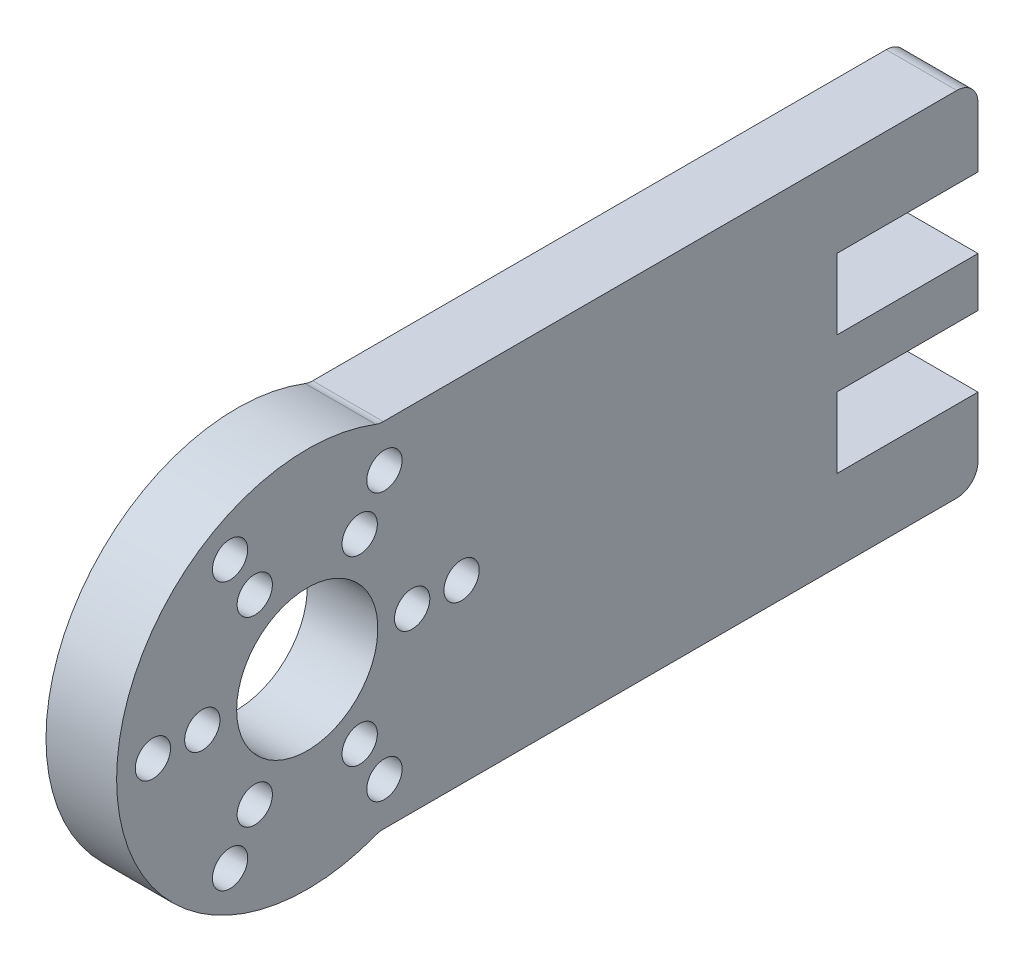
ISO-10303-21;
HEADER;
FILE_DESCRIPTION(('STEP AP214'),'2;1');
FILE_NAME('part.step','',(''),(''),'','','');
FILE_SCHEMA(('AUTOMOTIVE_DESIGN { 1 0 10303 214 1 1 1 1 }'));
ENDSEC;
DATA;
#1=APPLICATION_CONTEXT('core data for automotive mechanical design processes');
#2=APPLICATION_PROTOCOL_DEFINITION('international standard','automotive_design',2000,#1);
#3=PRODUCT_CONTEXT('',#1,'mechanical');
#4=PRODUCT('Part','Part','',(#3));
#5=PRODUCT_RELATED_PRODUCT_CATEGORY('part','',(#4));
#6=PRODUCT_DEFINITION_FORMATION('','',#4);
#7=PRODUCT_DEFINITION_CONTEXT('part definition',#1,'design');
#8=PRODUCT_DEFINITION('design','',#6,#7);
#9=PRODUCT_DEFINITION_SHAPE('','',#8);
#10=(LENGTH_UNIT() NAMED_UNIT(*) SI_UNIT(.MILLI.,.METRE.));
#11=(NAMED_UNIT(*) PLANE_ANGLE_UNIT() SI_UNIT($,.RADIAN.));
#12=(NAMED_UNIT(*) SI_UNIT($,.STERADIAN.) SOLID_ANGLE_UNIT());
#13=UNCERTAINTY_MEASURE_WITH_UNIT(LENGTH_MEASURE(1.E-05),#10,'distance_accuracy_value','');
#14=(GEOMETRIC_REPRESENTATION_CONTEXT(3) GLOBAL_UNCERTAINTY_ASSIGNED_CONTEXT((#13)) GLOBAL_UNIT_ASSIGNED_CONTEXT((#10,
#11,#12)) REPRESENTATION_CONTEXT('',''));
#15=CARTESIAN_POINT('',(0.,0.,0.));
#16=DIRECTION('',(0.,0.,1.));
#17=DIRECTION('',(1.,0.,0.));
#18=AXIS2_PLACEMENT_3D('',#15,#16,#17);
#19=CARTESIAN_POINT('',(5.,14.,42.1148351928655));
#20=DIRECTION('',(-1.,0.,0.));
#21=DIRECTION('',(0.,0.,1.));
#22=AXIS2_PLACEMENT_3D('',#19,#20,#21);
#23=CYLINDRICAL_SURFACE('',#22,1.5);
#24=DIRECTION('',(1.,0.,0.));
#25=VECTOR('',#24,1.);
#26=CARTESIAN_POINT('',(5.,12.5,42.1148351928655));
#27=LINE('',#26,#25);
#28=CARTESIAN_POINT('',(5.,12.5,42.1148351928655));
#29=VERTEX_POINT('',#28);
#30=CARTESIAN_POINT('',(0.,12.5,42.1148351928655));
#31=VERTEX_POINT('',#30);
#32=EDGE_CURVE('E98',#29,#31,#27,.F.);
#33=ORIENTED_EDGE('',*,*,#32,.T.);
#34=CARTESIAN_POINT('',(0.,14.,42.1148351928655));
#35=DIRECTION('',(-1.,0.,0.));
#36=DIRECTION('',(0.,0.,1.));
#37=AXIS2_PLACEMENT_3D('',#34,#35,#36);
#38=CIRCLE('',#37,1.5);
#39=CARTESIAN_POINT('',(0.,12.6,42.653351673579));
#40=VERTEX_POINT('',#39);
#41=EDGE_CURVE('E19',#40,#31,#38,.F.);
#42=ORIENTED_EDGE('',*,*,#41,.F.);
#43=DIRECTION('',(-1.,0.,0.));
#44=VECTOR('',#43,1.);
#45=CARTESIAN_POINT('',(5.,12.6,42.653351673579));
#46=LINE('',#45,#44);
#47=CARTESIAN_POINT('',(5.,12.6,42.653351673579));
#48=VERTEX_POINT('',#47);
#49=EDGE_CURVE('E149',#48,#40,#46,.T.);
#50=ORIENTED_EDGE('',*,*,#49,.F.);
#51=CARTESIAN_POINT('',(5.,14.,42.1148351928655));
#52=DIRECTION('',(-1.,0.,0.));
#53=DIRECTION('',(0.,0.,1.));
#54=AXIS2_PLACEMENT_3D('',#51,#52,#53);
#55=CIRCLE('',#54,1.5);
#56=EDGE_CURVE('E100',#29,#48,#55,.T.);
#57=ORIENTED_EDGE('',*,*,#56,.F.);
#58=EDGE_LOOP('',(#33,#42,#50,#57));
#59=FACE_BOUND('',#58,.T.);
#60=ADVANCED_FACE('F16',(#59),#23,.F.);
#61=CARTESIAN_POINT('',(5.,-14.,42.1148351928655));
#62=DIRECTION('',(-1.,0.,0.));
#63=DIRECTION('',(0.,0.,1.));
#64=AXIS2_PLACEMENT_3D('',#61,#62,#63);
#65=CYLINDRICAL_SURFACE('',#64,1.5);
#66=DIRECTION('',(-1.,0.,0.));
#67=VECTOR('',#66,1.);
#68=CARTESIAN_POINT('',(5.,-12.6,42.6533516735789));
#69=LINE('',#68,#67);
#70=CARTESIAN_POINT('',(0.,-12.6,42.6533516735789));
#71=VERTEX_POINT('',#70);
#72=CARTESIAN_POINT('',(5.,-12.6,42.6533516735789));
#73=VERTEX_POINT('',#72);
#74=EDGE_CURVE('E145',#71,#73,#69,.F.);
#75=ORIENTED_EDGE('',*,*,#74,.F.);
#76=CARTESIAN_POINT('',(0.,-14.,42.1148351928655));
#77=DIRECTION('',(-1.,0.,0.));
#78=DIRECTION('',(0.,0.,1.));
#79=AXIS2_PLACEMENT_3D('',#76,#77,#78);
#80=CIRCLE('',#79,1.5);
#81=CARTESIAN_POINT('',(0.,-12.5,42.1148351928655));
#82=VERTEX_POINT('',#81);
#83=EDGE_CURVE('E96',#82,#71,#80,.F.);
#84=ORIENTED_EDGE('',*,*,#83,.F.);
#85=DIRECTION('',(1.,0.,0.));
#86=VECTOR('',#85,1.);
#87=CARTESIAN_POINT('',(5.,-12.5,42.1148351928655));
#88=LINE('',#87,#86);
#89=CARTESIAN_POINT('',(5.,-12.5,42.1148351928655));
#90=VERTEX_POINT('',#89);
#91=EDGE_CURVE('E141',#90,#82,#88,.F.);
#92=ORIENTED_EDGE('',*,*,#91,.F.);
#93=CARTESIAN_POINT('',(5.,-14.,42.1148351928655));
#94=DIRECTION('',(-1.,0.,0.));
#95=DIRECTION('',(0.,0.,1.));
#96=AXIS2_PLACEMENT_3D('',#93,#94,#95);
#97=CIRCLE('',#96,1.5);
#98=EDGE_CURVE('E345',#73,#90,#97,.T.);
#99=ORIENTED_EDGE('',*,*,#98,.F.);
#100=EDGE_LOOP('',(#75,#84,#92,#99));
#101=FACE_BOUND('',#100,.T.);
#102=ADVANCED_FACE('F352',(#101),#65,.F.);
#103=CARTESIAN_POINT('',(5.,0.,0.));
#104=DIRECTION('',(1.,0.,0.));
#105=DIRECTION('',(0.,0.,-1.));
#106=AXIS2_PLACEMENT_3D('',#103,#104,#105);
#107=PLANE('',#106);
#108=CARTESIAN_POINT('',(5.,0.,47.5));
#109=DIRECTION('',(-1.,0.,0.));
#110=DIRECTION('',(0.,0.,1.));
#111=AXIS2_PLACEMENT_3D('',#108,#109,#110);
#112=CIRCLE('',#111,13.5);
#113=EDGE_CURVE('E148',#73,#48,#112,.T.);
#114=ORIENTED_EDGE('',*,*,#113,.F.);
#115=ORIENTED_EDGE('',*,*,#98,.T.);
#116=DIRECTION('',(0.,0.,-1.));
#117=VECTOR('',#116,1.);
#118=CARTESIAN_POINT('',(5.,-12.5,0.));
#119=LINE('',#118,#117);
#120=CARTESIAN_POINT('',(5.,-12.5,1.5));
#121=VERTEX_POINT('',#120);
#122=EDGE_CURVE('E144',#121,#90,#119,.F.);
#123=ORIENTED_EDGE('',*,*,#122,.F.);
#124=CARTESIAN_POINT('',(5.,-11.,1.5));
#125=DIRECTION('',(-1.,0.,0.));
#126=DIRECTION('',(0.,0.,1.));
#127=AXIS2_PLACEMENT_3D('',#124,#125,#126);
#128=CIRCLE('',#127,1.5);
#129=CARTESIAN_POINT('',(5.,-11.,0.));
#130=VERTEX_POINT('',#129);
#131=EDGE_CURVE('E140',#130,#121,#128,.T.);
#132=ORIENTED_EDGE('',*,*,#131,.F.);
#133=DIRECTION('',(0.,1.,0.));
#134=VECTOR('',#133,1.);
#135=CARTESIAN_POINT('',(5.,0.,0.));
#136=LINE('',#135,#134);
#137=CARTESIAN_POINT('',(5.,-6.75,0.));
#138=VERTEX_POINT('',#137);
#139=EDGE_CURVE('E125',#138,#130,#136,.F.);
#140=ORIENTED_EDGE('',*,*,#139,.F.);
#141=DIRECTION('',(0.,0.,1.));
#142=VECTOR('',#141,1.);
#143=CARTESIAN_POINT('',(5.,-6.75,0.));
#144=LINE('',#143,#142);
#145=CARTESIAN_POINT('',(5.,-6.75,10.));
#146=VERTEX_POINT('',#145);
#147=EDGE_CURVE('E225',#146,#138,#144,.F.);
#148=ORIENTED_EDGE('',*,*,#147,.F.);
#149=DIRECTION('',(0.,1.,0.));
#150=VECTOR('',#149,1.);
#151=CARTESIAN_POINT('',(5.,0.,10.));
#152=LINE('',#151,#150);
#153=CARTESIAN_POINT('',(5.,-1.75,10.));
#154=VERTEX_POINT('',#153);
#155=EDGE_CURVE('E222',#154,#146,#152,.F.);
#156=ORIENTED_EDGE('',*,*,#155,.F.);
#157=DIRECTION('',(0.,0.,-1.));
#158=VECTOR('',#157,1.);
#159=CARTESIAN_POINT('',(5.,-1.75,0.));
#160=LINE('',#159,#158);
#161=CARTESIAN_POINT('',(5.,-1.75,0.));
#162=VERTEX_POINT('',#161);
#163=EDGE_CURVE('E212',#162,#154,#160,.F.);
#164=ORIENTED_EDGE('',*,*,#163,.F.);
#165=DIRECTION('',(0.,1.,0.));
#166=VECTOR('',#165,1.);
#167=CARTESIAN_POINT('',(5.,0.,0.));
#168=LINE('',#167,#166);
#169=CARTESIAN_POINT('',(5.,1.75,0.));
#170=VERTEX_POINT('',#169);
#171=EDGE_CURVE('E202',#170,#162,#168,.F.);
#172=ORIENTED_EDGE('',*,*,#171,.F.);
#173=DIRECTION('',(0.,0.,-1.));
#174=VECTOR('',#173,1.);
#175=CARTESIAN_POINT('',(5.,1.75,0.));
#176=LINE('',#175,#174);
#177=CARTESIAN_POINT('',(5.,1.75,10.));
#178=VERTEX_POINT('',#177);
#179=EDGE_CURVE('E181',#170,#178,#176,.F.);
#180=ORIENTED_EDGE('',*,*,#179,.T.);
#181=DIRECTION('',(0.,1.,0.));
#182=VECTOR('',#181,1.);
#183=CARTESIAN_POINT('',(5.,0.,10.));
#184=LINE('',#183,#182);
#185=CARTESIAN_POINT('',(5.,6.75,10.));
#186=VERTEX_POINT('',#185);
#187=EDGE_CURVE('E170',#178,#186,#184,.T.);
#188=ORIENTED_EDGE('',*,*,#187,.T.);
#189=DIRECTION('',(0.,0.,1.));
#190=VECTOR('',#189,1.);
#191=CARTESIAN_POINT('',(5.,6.75,0.));
#192=LINE('',#191,#190);
#193=CARTESIAN_POINT('',(5.,6.75,0.));
#194=VERTEX_POINT('',#193);
#195=EDGE_CURVE('E159',#186,#194,#192,.F.);
#196=ORIENTED_EDGE('',*,*,#195,.T.);
#197=DIRECTION('',(0.,1.,0.));
#198=VECTOR('',#197,1.);
#199=CARTESIAN_POINT('',(5.,0.,0.));
#200=LINE('',#199,#198);
#201=CARTESIAN_POINT('',(5.,11.,0.));
#202=VERTEX_POINT('',#201);
#203=EDGE_CURVE('E158',#194,#202,#200,.T.);
#204=ORIENTED_EDGE('',*,*,#203,.T.);
#205=CARTESIAN_POINT('',(5.,11.,1.5));
#206=DIRECTION('',(-1.,0.,0.));
#207=DIRECTION('',(0.,0.,1.));
#208=AXIS2_PLACEMENT_3D('',#205,#206,#207);
#209=CIRCLE('',#208,1.5);
#210=CARTESIAN_POINT('',(5.,12.5,1.5));
#211=VERTEX_POINT('',#210);
#212=EDGE_CURVE('E154',#211,#202,#209,.T.);
#213=ORIENTED_EDGE('',*,*,#212,.F.);
#214=DIRECTION('',(0.,0.,-1.));
#215=VECTOR('',#214,1.);
#216=CARTESIAN_POINT('',(5.,12.5,0.));
#217=LINE('',#216,#215);
#218=EDGE_CURVE('E151',#211,#29,#217,.F.);
#219=ORIENTED_EDGE('',*,*,#218,.T.);
#220=ORIENTED_EDGE('',*,*,#56,.T.);
#221=EDGE_LOOP('',(#114,#115,#123,#132,#140,#148,#156,#164,#172,#180,#188,#196,#204,#213,#219,#220));
#222=FACE_BOUND('',#221,.T.);
#223=CARTESIAN_POINT('',(5.,6.43456875011842,43.785));
#224=DIRECTION('',(-1.,0.,0.));
#225=DIRECTION('',(0.,0.,1.));
#226=AXIS2_PLACEMENT_3D('',#223,#224,#225);
#227=CIRCLE('',#226,1.24999999999999);
#228=CARTESIAN_POINT('',(5.,6.43456875011842,45.035));
#229=VERTEX_POINT('',#228);
#230=EDGE_CURVE('E228',#229,#229,#227,.T.);
#231=ORIENTED_EDGE('',*,*,#230,.T.);
#232=EDGE_LOOP('',(#231));
#233=FACE_BOUND('',#232,.T.);
#234=CARTESIAN_POINT('',(5.,9.46565766336415,42.0349999999999));
#235=DIRECTION('',(-1.,0.,0.));
#236=DIRECTION('',(0.,0.,1.));
#237=AXIS2_PLACEMENT_3D('',#234,#235,#236);
#238=CIRCLE('',#237,1.24999999999999);
#239=CARTESIAN_POINT('',(5.,9.46565766336415,43.2849999999999));
#240=VERTEX_POINT('',#239);
#241=EDGE_CURVE('E309',#240,#240,#238,.T.);
#242=ORIENTED_EDGE('',*,*,#241,.T.);
#243=EDGE_LOOP('',(#242));
#244=FACE_BOUND('',#243,.T.);
#245=CARTESIAN_POINT('',(5.,6.43456875011861,51.2150000000001));
#246=DIRECTION('',(-1.,0.,0.));
#247=DIRECTION('',(0.,0.,1.));
#248=AXIS2_PLACEMENT_3D('',#245,#246,#247);
#249=CIRCLE('',#248,1.25);
#250=CARTESIAN_POINT('',(5.,6.43456875011861,52.4650000000001));
#251=VERTEX_POINT('',#250);
#252=EDGE_CURVE('E312',#251,#251,#249,.T.);
#253=ORIENTED_EDGE('',*,*,#252,.T.);
#254=EDGE_LOOP('',(#253));
#255=FACE_BOUND('',#254,.T.);
#256=CARTESIAN_POINT('',(5.,9.46565766336395,52.965));
#257=DIRECTION('',(-1.,0.,0.));
#258=DIRECTION('',(0.,0.,1.));
#259=AXIS2_PLACEMENT_3D('',#256,#257,#258);
#260=CIRCLE('',#259,1.25);
#261=CARTESIAN_POINT('',(5.,9.46565766336395,54.215));
#262=VERTEX_POINT('',#261);
#263=EDGE_CURVE('E315',#262,#262,#260,.T.);
#264=ORIENTED_EDGE('',*,*,#263,.T.);
#265=EDGE_LOOP('',(#264));
#266=FACE_BOUND('',#265,.T.);
#267=CARTESIAN_POINT('',(5.,0.,54.93));
#268=DIRECTION('',(-1.,0.,0.));
#269=DIRECTION('',(0.,0.,1.));
#270=AXIS2_PLACEMENT_3D('',#267,#268,#269);
#271=CIRCLE('',#270,1.24999999999999);
#272=CARTESIAN_POINT('',(5.,0.,56.18));
#273=VERTEX_POINT('',#272);
#274=EDGE_CURVE('E318',#273,#273,#271,.T.);
#275=ORIENTED_EDGE('',*,*,#274,.T.);
#276=EDGE_LOOP('',(#275));
#277=FACE_BOUND('',#276,.T.);
#278=CARTESIAN_POINT('',(5.,0.,58.43));
#279=DIRECTION('',(-1.,0.,0.));
#280=DIRECTION('',(0.,0.,1.));
#281=AXIS2_PLACEMENT_3D('',#278,#279,#280);
#282=CIRCLE('',#281,1.24999999999999);
#283=CARTESIAN_POINT('',(5.,0.,59.68));
#284=VERTEX_POINT('',#283);
#285=EDGE_CURVE('E321',#284,#284,#282,.T.);
#286=ORIENTED_EDGE('',*,*,#285,.T.);
#287=EDGE_LOOP('',(#286));
#288=FACE_BOUND('',#287,.T.);
#289=CARTESIAN_POINT('',(5.,0.,47.5));
#290=DIRECTION('',(-1.,0.,0.));
#291=DIRECTION('',(0.,0.,1.));
#292=AXIS2_PLACEMENT_3D('',#289,#290,#291);
#293=CIRCLE('',#292,5.);
#294=CARTESIAN_POINT('',(5.,0.,52.5));
#295=VERTEX_POINT('',#294);
#296=EDGE_CURVE('E324',#295,#295,#293,.T.);
#297=ORIENTED_EDGE('',*,*,#296,.T.);
#298=EDGE_LOOP('',(#297));
#299=FACE_BOUND('',#298,.T.);
#300=CARTESIAN_POINT('',(5.,0.,36.57));
#301=DIRECTION('',(-1.,0.,0.));
#302=DIRECTION('',(0.,0.,1.));
#303=AXIS2_PLACEMENT_3D('',#300,#301,#302);
#304=CIRCLE('',#303,1.24999999999999);
#305=CARTESIAN_POINT('',(5.,0.,37.82));
#306=VERTEX_POINT('',#305);
#307=EDGE_CURVE('E327',#306,#306,#304,.T.);
#308=ORIENTED_EDGE('',*,*,#307,.T.);
#309=EDGE_LOOP('',(#308));
#310=FACE_BOUND('',#309,.T.);
#311=CARTESIAN_POINT('',(5.,0.,40.07));
#312=DIRECTION('',(-1.,0.,0.));
#313=DIRECTION('',(0.,0.,1.));
#314=AXIS2_PLACEMENT_3D('',#311,#312,#313);
#315=CIRCLE('',#314,1.24999999999999);
#316=CARTESIAN_POINT('',(5.,0.,41.32));
#317=VERTEX_POINT('',#316);
#318=EDGE_CURVE('E330',#317,#317,#315,.T.);
#319=ORIENTED_EDGE('',*,*,#318,.T.);
#320=EDGE_LOOP('',(#319));
#321=FACE_BOUND('',#320,.T.);
#322=CARTESIAN_POINT('',(5.,-9.46565766336389,42.035));
#323=DIRECTION('',(-1.,0.,0.));
#324=DIRECTION('',(0.,0.,1.));
#325=AXIS2_PLACEMENT_3D('',#322,#323,#324);
#326=CIRCLE('',#325,1.24999999999999);
#327=CARTESIAN_POINT('',(5.,-9.46565766336389,43.285));
#328=VERTEX_POINT('',#327);
#329=EDGE_CURVE('E333',#328,#328,#326,.T.);
#330=ORIENTED_EDGE('',*,*,#329,.T.);
#331=EDGE_LOOP('',(#330));
#332=FACE_BOUND('',#331,.T.);
#333=CARTESIAN_POINT('',(5.,-6.43456875011817,43.7850000000001));
#334=DIRECTION('',(-1.,0.,0.));
#335=DIRECTION('',(0.,0.,1.));
#336=AXIS2_PLACEMENT_3D('',#333,#334,#335);
#337=CIRCLE('',#336,1.24999999999999);
#338=CARTESIAN_POINT('',(5.,-6.43456875011817,45.0350000000001));
#339=VERTEX_POINT('',#338);
#340=EDGE_CURVE('E336',#339,#339,#337,.T.);
#341=ORIENTED_EDGE('',*,*,#340,.T.);
#342=EDGE_LOOP('',(#341));
#343=FACE_BOUND('',#342,.T.);
#344=CARTESIAN_POINT('',(5.,-9.46565766336371,52.9649999999999));
#345=DIRECTION('',(-1.,0.,0.));
#346=DIRECTION('',(0.,0.,1.));
#347=AXIS2_PLACEMENT_3D('',#344,#345,#346);
#348=CIRCLE('',#347,1.25000000000001);
#349=CARTESIAN_POINT('',(5.,-9.46565766336371,54.2149999999999));
#350=VERTEX_POINT('',#349);
#351=EDGE_CURVE('E339',#350,#350,#348,.T.);
#352=ORIENTED_EDGE('',*,*,#351,.T.);
#353=EDGE_LOOP('',(#352));
#354=FACE_BOUND('',#353,.T.);
#355=CARTESIAN_POINT('',(5.,-6.43456875011817,51.2149999999999));
#356=DIRECTION('',(-1.,0.,0.));
#357=DIRECTION('',(0.,0.,1.));
#358=AXIS2_PLACEMENT_3D('',#355,#356,#357);
#359=CIRCLE('',#358,1.24999999999999);
#360=CARTESIAN_POINT('',(5.,-6.43456875011817,52.4649999999999));
#361=VERTEX_POINT('',#360);
#362=EDGE_CURVE('E342',#361,#361,#359,.T.);
#363=ORIENTED_EDGE('',*,*,#362,.T.);
#364=EDGE_LOOP('',(#363));
#365=FACE_BOUND('',#364,.T.);
#366=ADVANCED_FACE('F357',(#222,#233,#244,#255,#266,#277,#288,#299,#310,#321,#332,#343,#354,
#365),#107,.T.);
#367=CARTESIAN_POINT('',(5.,-6.43456875011817,51.2149999999999));
#368=DIRECTION('',(-1.,0.,0.));
#369=DIRECTION('',(0.,0.,1.));
#370=AXIS2_PLACEMENT_3D('',#367,#368,#369);
#371=CYLINDRICAL_SURFACE('',#370,1.24999999999999);
#372=CARTESIAN_POINT('',(0.,-6.43456875011817,51.2149999999999));
#373=DIRECTION('',(-1.,0.,0.));
#374=DIRECTION('',(0.,0.,1.));
#375=AXIS2_PLACEMENT_3D('',#372,#373,#374);
#376=CIRCLE('',#375,1.24999999999999);
#377=CARTESIAN_POINT('',(0.,-6.43456875011817,52.4649999999999));
#378=VERTEX_POINT('',#377);
#379=EDGE_CURVE('E128',#378,#378,#376,.T.);
#380=ORIENTED_EDGE('',*,*,#379,.T.);
#381=EDGE_LOOP('',(#380));
#382=FACE_BOUND('',#381,.T.);
#383=ORIENTED_EDGE('',*,*,#362,.F.);
#384=EDGE_LOOP('',(#383));
#385=FACE_BOUND('',#384,.T.);
#386=ADVANCED_FACE('F668',(#382,#385),#371,.F.);
#387=CARTESIAN_POINT('',(5.,-9.46565766336371,52.9649999999999));
#388=DIRECTION('',(-1.,0.,0.));
#389=DIRECTION('',(0.,0.,1.));
#390=AXIS2_PLACEMENT_3D('',#387,#388,#389);
#391=CYLINDRICAL_SURFACE('',#390,1.25000000000001);
#392=CARTESIAN_POINT('',(0.,-9.46565766336371,52.9649999999999));
#393=DIRECTION('',(-1.,0.,0.));
#394=DIRECTION('',(0.,0.,1.));
#395=AXIS2_PLACEMENT_3D('',#392,#393,#394);
#396=CIRCLE('',#395,1.25000000000001);
#397=CARTESIAN_POINT('',(0.,-9.46565766336371,54.2149999999999));
#398=VERTEX_POINT('',#397);
#399=EDGE_CURVE('E299',#398,#398,#396,.T.);
#400=ORIENTED_EDGE('',*,*,#399,.T.);
#401=EDGE_LOOP('',(#400));
#402=FACE_BOUND('',#401,.T.);
#403=ORIENTED_EDGE('',*,*,#351,.F.);
#404=EDGE_LOOP('',(#403));
#405=FACE_BOUND('',#404,.T.);
#406=ADVANCED_FACE('F659',(#402,#405),#391,.F.);
#407=CARTESIAN_POINT('',(5.,-6.43456875011817,43.7850000000001));
#408=DIRECTION('',(-1.,0.,0.));
#409=DIRECTION('',(0.,0.,1.));
#410=AXIS2_PLACEMENT_3D('',#407,#408,#409);
#411=CYLINDRICAL_SURFACE('',#410,1.24999999999999);
#412=CARTESIAN_POINT('',(0.,-6.43456875011817,43.7850000000001));
#413=DIRECTION('',(-1.,0.,0.));
#414=DIRECTION('',(0.,0.,1.));
#415=AXIS2_PLACEMENT_3D('',#412,#413,#414);
#416=CIRCLE('',#415,1.24999999999999);
#417=CARTESIAN_POINT('',(0.,-6.43456875011817,45.0350000000001));
#418=VERTEX_POINT('',#417);
#419=EDGE_CURVE('E296',#418,#418,#416,.T.);
#420=ORIENTED_EDGE('',*,*,#419,.T.);
#421=EDGE_LOOP('',(#420));
#422=FACE_BOUND('',#421,.T.);
#423=ORIENTED_EDGE('',*,*,#340,.F.);
#424=EDGE_LOOP('',(#423));
#425=FACE_BOUND('',#424,.T.);
#426=ADVANCED_FACE('F650',(#422,#425),#411,.F.);
#427=CARTESIAN_POINT('',(5.,-9.46565766336389,42.035));
#428=DIRECTION('',(-1.,0.,0.));
#429=DIRECTION('',(0.,0.,1.));
#430=AXIS2_PLACEMENT_3D('',#427,#428,#429);
#431=CYLINDRICAL_SURFACE('',#430,1.24999999999999);
#432=CARTESIAN_POINT('',(0.,-9.46565766336389,42.035));
#433=DIRECTION('',(-1.,0.,0.));
#434=DIRECTION('',(0.,0.,1.));
#435=AXIS2_PLACEMENT_3D('',#432,#433,#434);
#436=CIRCLE('',#435,1.24999999999999);
#437=CARTESIAN_POINT('',(0.,-9.46565766336389,43.285));
#438=VERTEX_POINT('',#437);
#439=EDGE_CURVE('E293',#438,#438,#436,.T.);
#440=ORIENTED_EDGE('',*,*,#439,.T.);
#441=EDGE_LOOP('',(#440));
#442=FACE_BOUND('',#441,.T.);
#443=ORIENTED_EDGE('',*,*,#329,.F.);
#444=EDGE_LOOP('',(#443));
#445=FACE_BOUND('',#444,.T.);
#446=ADVANCED_FACE('F641',(#442,#445),#431,.F.);
#447=CARTESIAN_POINT('',(5.,0.,40.07));
#448=DIRECTION('',(-1.,0.,0.));
#449=DIRECTION('',(0.,0.,1.));
#450=AXIS2_PLACEMENT_3D('',#447,#448,#449);
#451=CYLINDRICAL_SURFACE('',#450,1.24999999999999);
#452=CARTESIAN_POINT('',(0.,0.,40.07));
#453=DIRECTION('',(-1.,0.,0.));
#454=DIRECTION('',(0.,0.,1.));
#455=AXIS2_PLACEMENT_3D('',#452,#453,#454);
#456=CIRCLE('',#455,1.24999999999999);
#457=CARTESIAN_POINT('',(0.,0.,41.32));
#458=VERTEX_POINT('',#457);
#459=EDGE_CURVE('E290',#458,#458,#456,.T.);
#460=ORIENTED_EDGE('',*,*,#459,.T.);
#461=EDGE_LOOP('',(#460));
#462=FACE_BOUND('',#461,.T.);
#463=ORIENTED_EDGE('',*,*,#318,.F.);
#464=EDGE_LOOP('',(#463));
#465=FACE_BOUND('',#464,.T.);
#466=ADVANCED_FACE('F632',(#462,#465),#451,.F.);
#467=CARTESIAN_POINT('',(5.,0.,36.57));
#468=DIRECTION('',(-1.,0.,0.));
#469=DIRECTION('',(0.,0.,1.));
#470=AXIS2_PLACEMENT_3D('',#467,#468,#469);
#471=CYLINDRICAL_SURFACE('',#470,1.24999999999999);
#472=CARTESIAN_POINT('',(0.,0.,36.57));
#473=DIRECTION('',(-1.,0.,0.));
#474=DIRECTION('',(0.,0.,1.));
#475=AXIS2_PLACEMENT_3D('',#472,#473,#474);
#476=CIRCLE('',#475,1.24999999999999);
#477=CARTESIAN_POINT('',(0.,0.,37.82));
#478=VERTEX_POINT('',#477);
#479=EDGE_CURVE('E287',#478,#478,#476,.T.);
#480=ORIENTED_EDGE('',*,*,#479,.T.);
#481=EDGE_LOOP('',(#480));
#482=FACE_BOUND('',#481,.T.);
#483=ORIENTED_EDGE('',*,*,#307,.F.);
#484=EDGE_LOOP('',(#483));
#485=FACE_BOUND('',#484,.T.);
#486=ADVANCED_FACE('F623',(#482,#485),#471,.F.);
#487=CARTESIAN_POINT('',(5.,0.,47.5));
#488=DIRECTION('',(-1.,0.,0.));
#489=DIRECTION('',(0.,0.,1.));
#490=AXIS2_PLACEMENT_3D('',#487,#488,#489);
#491=CYLINDRICAL_SURFACE('',#490,5.);
#492=CARTESIAN_POINT('',(0.,0.,47.5));
#493=DIRECTION('',(-1.,0.,0.));
#494=DIRECTION('',(0.,0.,1.));
#495=AXIS2_PLACEMENT_3D('',#492,#493,#494);
#496=CIRCLE('',#495,5.);
#497=CARTESIAN_POINT('',(0.,0.,52.5));
#498=VERTEX_POINT('',#497);
#499=EDGE_CURVE('E284',#498,#498,#496,.T.);
#500=ORIENTED_EDGE('',*,*,#499,.T.);
#501=EDGE_LOOP('',(#500));
#502=FACE_BOUND('',#501,.T.);
#503=ORIENTED_EDGE('',*,*,#296,.F.);
#504=EDGE_LOOP('',(#503));
#505=FACE_BOUND('',#504,.T.);
#506=ADVANCED_FACE('F614',(#502,#505),#491,.F.);
#507=CARTESIAN_POINT('',(5.,0.,58.43));
#508=DIRECTION('',(-1.,0.,0.));
#509=DIRECTION('',(0.,0.,1.));
#510=AXIS2_PLACEMENT_3D('',#507,#508,#509);
#511=CYLINDRICAL_SURFACE('',#510,1.24999999999999);
#512=CARTESIAN_POINT('',(0.,0.,58.43));
#513=DIRECTION('',(-1.,0.,0.));
#514=DIRECTION('',(0.,0.,1.));
#515=AXIS2_PLACEMENT_3D('',#512,#513,#514);
#516=CIRCLE('',#515,1.24999999999999);
#517=CARTESIAN_POINT('',(0.,0.,59.68));
#518=VERTEX_POINT('',#517);
#519=EDGE_CURVE('E281',#518,#518,#516,.T.);
#520=ORIENTED_EDGE('',*,*,#519,.T.);
#521=EDGE_LOOP('',(#520));
#522=FACE_BOUND('',#521,.T.);
#523=ORIENTED_EDGE('',*,*,#285,.F.);
#524=EDGE_LOOP('',(#523));
#525=FACE_BOUND('',#524,.T.);
#526=ADVANCED_FACE('F605',(#522,#525),#511,.F.);
#527=CARTESIAN_POINT('',(5.,0.,54.93));
#528=DIRECTION('',(-1.,0.,0.));
#529=DIRECTION('',(0.,0.,1.));
#530=AXIS2_PLACEMENT_3D('',#527,#528,#529);
#531=CYLINDRICAL_SURFACE('',#530,1.24999999999999);
#532=CARTESIAN_POINT('',(0.,0.,54.93));
#533=DIRECTION('',(-1.,0.,0.));
#534=DIRECTION('',(0.,0.,1.));
#535=AXIS2_PLACEMENT_3D('',#532,#533,#534);
#536=CIRCLE('',#535,1.24999999999999);
#537=CARTESIAN_POINT('',(0.,0.,56.18));
#538=VERTEX_POINT('',#537);
#539=EDGE_CURVE('E278',#538,#538,#536,.T.);
#540=ORIENTED_EDGE('',*,*,#539,.T.);
#541=EDGE_LOOP('',(#540));
#542=FACE_BOUND('',#541,.T.);
#543=ORIENTED_EDGE('',*,*,#274,.F.);
#544=EDGE_LOOP('',(#543));
#545=FACE_BOUND('',#544,.T.);
#546=ADVANCED_FACE('F596',(#542,#545),#531,.F.);
#547=CARTESIAN_POINT('',(5.,9.46565766336395,52.965));
#548=DIRECTION('',(-1.,0.,0.));
#549=DIRECTION('',(0.,0.,1.));
#550=AXIS2_PLACEMENT_3D('',#547,#548,#549);
#551=CYLINDRICAL_SURFACE('',#550,1.25);
#552=CARTESIAN_POINT('',(0.,9.46565766336395,52.965));
#553=DIRECTION('',(-1.,0.,0.));
#554=DIRECTION('',(0.,0.,1.));
#555=AXIS2_PLACEMENT_3D('',#552,#553,#554);
#556=CIRCLE('',#555,1.25);
#557=CARTESIAN_POINT('',(0.,9.46565766336395,54.215));
#558=VERTEX_POINT('',#557);
#559=EDGE_CURVE('E275',#558,#558,#556,.T.);
#560=ORIENTED_EDGE('',*,*,#559,.T.);
#561=EDGE_LOOP('',(#560));
#562=FACE_BOUND('',#561,.T.);
#563=ORIENTED_EDGE('',*,*,#263,.F.);
#564=EDGE_LOOP('',(#563));
#565=FACE_BOUND('',#564,.T.);
#566=ADVANCED_FACE('F587',(#562,#565),#551,.F.);
#567=CARTESIAN_POINT('',(5.,6.43456875011861,51.2150000000001));
#568=DIRECTION('',(-1.,0.,0.));
#569=DIRECTION('',(0.,0.,1.));
#570=AXIS2_PLACEMENT_3D('',#567,#568,#569);
#571=CYLINDRICAL_SURFACE('',#570,1.25);
#572=CARTESIAN_POINT('',(0.,6.43456875011861,51.2150000000001));
#573=DIRECTION('',(-1.,0.,0.));
#574=DIRECTION('',(0.,0.,1.));
#575=AXIS2_PLACEMENT_3D('',#572,#573,#574);
#576=CIRCLE('',#575,1.25);
#577=CARTESIAN_POINT('',(0.,6.43456875011861,52.4650000000001));
#578=VERTEX_POINT('',#577);
#579=EDGE_CURVE('E272',#578,#578,#576,.T.);
#580=ORIENTED_EDGE('',*,*,#579,.T.);
#581=EDGE_LOOP('',(#580));
#582=FACE_BOUND('',#581,.T.);
#583=ORIENTED_EDGE('',*,*,#252,.F.);
#584=EDGE_LOOP('',(#583));
#585=FACE_BOUND('',#584,.T.);
#586=ADVANCED_FACE('F578',(#582,#585),#571,.F.);
#587=CARTESIAN_POINT('',(5.,9.46565766336415,42.0349999999999));
#588=DIRECTION('',(-1.,0.,0.));
#589=DIRECTION('',(0.,0.,1.));
#590=AXIS2_PLACEMENT_3D('',#587,#588,#589);
#591=CYLINDRICAL_SURFACE('',#590,1.24999999999999);
#592=CARTESIAN_POINT('',(0.,9.46565766336415,42.0349999999999));
#593=DIRECTION('',(-1.,0.,0.));
#594=DIRECTION('',(0.,0.,1.));
#595=AXIS2_PLACEMENT_3D('',#592,#593,#594);
#596=CIRCLE('',#595,1.24999999999999);
#597=CARTESIAN_POINT('',(0.,9.46565766336415,43.2849999999999));
#598=VERTEX_POINT('',#597);
#599=EDGE_CURVE('E269',#598,#598,#596,.T.);
#600=ORIENTED_EDGE('',*,*,#599,.T.);
#601=EDGE_LOOP('',(#600));
#602=FACE_BOUND('',#601,.T.);
#603=ORIENTED_EDGE('',*,*,#241,.F.);
#604=EDGE_LOOP('',(#603));
#605=FACE_BOUND('',#604,.T.);
#606=ADVANCED_FACE('F569',(#602,#605),#591,.F.);
#607=CARTESIAN_POINT('',(5.,6.43456875011842,43.785));
#608=DIRECTION('',(-1.,0.,0.));
#609=DIRECTION('',(0.,0.,1.));
#610=AXIS2_PLACEMENT_3D('',#607,#608,#609);
#611=CYLINDRICAL_SURFACE('',#610,1.24999999999999);
#612=CARTESIAN_POINT('',(0.,6.43456875011842,43.785));
#613=DIRECTION('',(-1.,0.,0.));
#614=DIRECTION('',(0.,0.,1.));
#615=AXIS2_PLACEMENT_3D('',#612,#613,#614);
#616=CIRCLE('',#615,1.24999999999999);
#617=CARTESIAN_POINT('',(0.,6.43456875011842,45.035));
#618=VERTEX_POINT('',#617);
#619=EDGE_CURVE('E135',#618,#618,#616,.T.);
#620=ORIENTED_EDGE('',*,*,#619,.T.);
#621=EDGE_LOOP('',(#620));
#622=FACE_BOUND('',#621,.T.);
#623=ORIENTED_EDGE('',*,*,#230,.F.);
#624=EDGE_LOOP('',(#623));
#625=FACE_BOUND('',#624,.T.);
#626=ADVANCED_FACE('F561',(#622,#625),#611,.F.);
#627=CARTESIAN_POINT('',(5.,-6.75,0.));
#628=DIRECTION('',(0.,1.,0.));
#629=DIRECTION('',(0.,0.,1.));
#630=AXIS2_PLACEMENT_3D('',#627,#628,#629);
#631=PLANE('',#630);
#632=ORIENTED_EDGE('',*,*,#147,.T.);
#633=DIRECTION('',(1.,0.,0.));
#634=VECTOR('',#633,1.);
#635=CARTESIAN_POINT('',(5.,-6.75,0.));
#636=LINE('',#635,#634);
#637=CARTESIAN_POINT('',(0.,-6.75,0.));
#638=VERTEX_POINT('',#637);
#639=EDGE_CURVE('E124',#638,#138,#636,.T.);
#640=ORIENTED_EDGE('',*,*,#639,.F.);
#641=DIRECTION('',(0.,0.,-1.));
#642=VECTOR('',#641,1.);
#643=CARTESIAN_POINT('',(0.,-6.75,0.));
#644=LINE('',#643,#642);
#645=CARTESIAN_POINT('',(0.,-6.75,10.));
#646=VERTEX_POINT('',#645);
#647=EDGE_CURVE('E131',#638,#646,#644,.F.);
#648=ORIENTED_EDGE('',*,*,#647,.T.);
#649=DIRECTION('',(-1.,0.,0.));
#650=VECTOR('',#649,1.);
#651=CARTESIAN_POINT('',(5.,-6.75,10.));
#652=LINE('',#651,#650);
#653=EDGE_CURVE('E219',#146,#646,#652,.T.);
#654=ORIENTED_EDGE('',*,*,#653,.F.);
#655=EDGE_LOOP('',(#632,#640,#648,#654));
#656=FACE_BOUND('',#655,.T.);
#657=ADVANCED_FACE('F415',(#656),#631,.T.);
#658=CARTESIAN_POINT('',(5.,0.,10.));
#659=DIRECTION('',(0.,0.,-1.));
#660=DIRECTION('',(-1.,0.,0.));
#661=AXIS2_PLACEMENT_3D('',#658,#659,#660);
#662=PLANE('',#661);
#663=ORIENTED_EDGE('',*,*,#155,.T.);
#664=ORIENTED_EDGE('',*,*,#653,.T.);
#665=DIRECTION('',(0.,1.,0.));
#666=VECTOR('',#665,1.);
#667=CARTESIAN_POINT('',(0.,0.,10.));
#668=LINE('',#667,#666);
#669=CARTESIAN_POINT('',(0.,-1.75,10.));
#670=VERTEX_POINT('',#669);
#671=EDGE_CURVE('E134',#646,#670,#668,.T.);
#672=ORIENTED_EDGE('',*,*,#671,.T.);
#673=DIRECTION('',(1.,0.,0.));
#674=VECTOR('',#673,1.);
#675=CARTESIAN_POINT('',(5.,-1.75,10.));
#676=LINE('',#675,#674);
#677=EDGE_CURVE('E209',#154,#670,#676,.F.);
#678=ORIENTED_EDGE('',*,*,#677,.F.);
#679=EDGE_LOOP('',(#663,#664,#672,#678));
#680=FACE_BOUND('',#679,.T.);
#681=ADVANCED_FACE('F407',(#680),#662,.T.);
#682=CARTESIAN_POINT('',(5.,-1.75,0.));
#683=DIRECTION('',(0.,-1.,0.));
#684=DIRECTION('',(0.,0.,-1.));
#685=AXIS2_PLACEMENT_3D('',#682,#683,#684);
#686=PLANE('',#685);
#687=ORIENTED_EDGE('',*,*,#163,.T.);
#688=ORIENTED_EDGE('',*,*,#677,.T.);
#689=DIRECTION('',(0.,0.,-1.));
#690=VECTOR('',#689,1.);
#691=CARTESIAN_POINT('',(0.,-1.75,0.));
#692=LINE('',#691,#690);
#693=CARTESIAN_POINT('',(0.,-1.75,0.));
#694=VERTEX_POINT('',#693);
#695=EDGE_CURVE('E197',#670,#694,#692,.T.);
#696=ORIENTED_EDGE('',*,*,#695,.T.);
#697=DIRECTION('',(1.,0.,0.));
#698=VECTOR('',#697,1.);
#699=CARTESIAN_POINT('',(5.,-1.75,0.));
#700=LINE('',#699,#698);
#701=EDGE_CURVE('E192',#162,#694,#700,.F.);
#702=ORIENTED_EDGE('',*,*,#701,.F.);
#703=EDGE_LOOP('',(#687,#688,#696,#702));
#704=FACE_BOUND('',#703,.T.);
#705=ADVANCED_FACE('F422',(#704),#686,.T.);
#706=CARTESIAN_POINT('',(5.,0.,0.));
#707=DIRECTION('',(0.,0.,-1.));
#708=DIRECTION('',(0.,1.,0.));
#709=AXIS2_PLACEMENT_3D('',#706,#707,#708);
#710=PLANE('',#709);
#711=ORIENTED_EDGE('',*,*,#171,.T.);
#712=ORIENTED_EDGE('',*,*,#701,.T.);
#713=DIRECTION('',(0.,1.,0.));
#714=VECTOR('',#713,1.);
#715=CARTESIAN_POINT('',(0.,0.,0.));
#716=LINE('',#715,#714);
#717=CARTESIAN_POINT('',(0.,1.75,0.));
#718=VERTEX_POINT('',#717);
#719=EDGE_CURVE('E186',#694,#718,#716,.T.);
#720=ORIENTED_EDGE('',*,*,#719,.T.);
#721=DIRECTION('',(1.,0.,0.));
#722=VECTOR('',#721,1.);
#723=CARTESIAN_POINT('',(5.,1.75,0.));
#724=LINE('',#723,#722);
#725=EDGE_CURVE('E189',#718,#170,#724,.T.);
#726=ORIENTED_EDGE('',*,*,#725,.T.);
#727=EDGE_LOOP('',(#711,#712,#720,#726));
#728=FACE_BOUND('',#727,.T.);
#729=ADVANCED_FACE('F428',(#728),#710,.T.);
#730=CARTESIAN_POINT('',(5.,1.75,0.));
#731=DIRECTION('',(0.,-1.,0.));
#732=DIRECTION('',(0.,0.,-1.));
#733=AXIS2_PLACEMENT_3D('',#730,#731,#732);
#734=PLANE('',#733);
#735=DIRECTION('',(1.,0.,0.));
#736=VECTOR('',#735,1.);
#737=CARTESIAN_POINT('',(5.,1.75,10.));
#738=LINE('',#737,#736);
#739=CARTESIAN_POINT('',(0.,1.75,10.));
#740=VERTEX_POINT('',#739);
#741=EDGE_CURVE('E178',#740,#178,#738,.T.);
#742=ORIENTED_EDGE('',*,*,#741,.T.);
#743=ORIENTED_EDGE('',*,*,#179,.F.);
#744=ORIENTED_EDGE('',*,*,#725,.F.);
#745=DIRECTION('',(0.,0.,-1.));
#746=VECTOR('',#745,1.);
#747=CARTESIAN_POINT('',(0.,1.75,0.));
#748=LINE('',#747,#746);
#749=EDGE_CURVE('E175',#718,#740,#748,.F.);
#750=ORIENTED_EDGE('',*,*,#749,.T.);
#751=EDGE_LOOP('',(#742,#743,#744,#750));
#752=FACE_BOUND('',#751,.T.);
#753=ADVANCED_FACE('F427',(#752),#734,.F.);
#754=CARTESIAN_POINT('',(5.,0.,10.));
#755=DIRECTION('',(0.,0.,1.));
#756=DIRECTION('',(1.,0.,0.));
#757=AXIS2_PLACEMENT_3D('',#754,#755,#756);
#758=PLANE('',#757);
#759=DIRECTION('',(1.,0.,0.));
#760=VECTOR('',#759,1.);
#761=CARTESIAN_POINT('',(5.,6.75,10.));
#762=LINE('',#761,#760);
#763=CARTESIAN_POINT('',(0.,6.75,10.));
#764=VERTEX_POINT('',#763);
#765=EDGE_CURVE('E167',#764,#186,#762,.T.);
#766=ORIENTED_EDGE('',*,*,#765,.T.);
#767=ORIENTED_EDGE('',*,*,#187,.F.);
#768=ORIENTED_EDGE('',*,*,#741,.F.);
#769=DIRECTION('',(0.,1.,0.));
#770=VECTOR('',#769,1.);
#771=CARTESIAN_POINT('',(0.,0.,10.));
#772=LINE('',#771,#770);
#773=EDGE_CURVE('E164',#740,#764,#772,.T.);
#774=ORIENTED_EDGE('',*,*,#773,.T.);
#775=EDGE_LOOP('',(#766,#767,#768,#774));
#776=FACE_BOUND('',#775,.T.);
#777=ADVANCED_FACE('F436',(#776),#758,.F.);
#778=CARTESIAN_POINT('',(5.,6.75,0.));
#779=DIRECTION('',(0.,1.,0.));
#780=DIRECTION('',(0.,0.,1.));
#781=AXIS2_PLACEMENT_3D('',#778,#779,#780);
#782=PLANE('',#781);
#783=DIRECTION('',(1.,0.,0.));
#784=VECTOR('',#783,1.);
#785=CARTESIAN_POINT('',(5.,6.75,0.));
#786=LINE('',#785,#784);
#787=CARTESIAN_POINT('',(0.,6.75,0.));
#788=VERTEX_POINT('',#787);
#789=EDGE_CURVE('E155',#788,#194,#786,.T.);
#790=ORIENTED_EDGE('',*,*,#789,.T.);
#791=ORIENTED_EDGE('',*,*,#195,.F.);
#792=ORIENTED_EDGE('',*,*,#765,.F.);
#793=DIRECTION('',(0.,0.,-1.));
#794=VECTOR('',#793,1.);
#795=CARTESIAN_POINT('',(0.,6.75,0.));
#796=LINE('',#795,#794);
#797=EDGE_CURVE('E120',#764,#788,#796,.T.);
#798=ORIENTED_EDGE('',*,*,#797,.T.);
#799=EDGE_LOOP('',(#790,#791,#792,#798));
#800=FACE_BOUND('',#799,.T.);
#801=ADVANCED_FACE('F373',(#800),#782,.F.);
#802=CARTESIAN_POINT('',(5.,0.,0.));
#803=DIRECTION('',(0.,0.,1.));
#804=DIRECTION('',(1.,0.,0.));
#805=AXIS2_PLACEMENT_3D('',#802,#803,#804);
#806=PLANE('',#805);
#807=DIRECTION('',(-1.,0.,0.));
#808=VECTOR('',#807,1.);
#809=CARTESIAN_POINT('',(5.,11.,0.));
#810=LINE('',#809,#808);
#811=CARTESIAN_POINT('',(0.,11.,0.));
#812=VERTEX_POINT('',#811);
#813=EDGE_CURVE('E105',#202,#812,#810,.T.);
#814=ORIENTED_EDGE('',*,*,#813,.F.);
#815=ORIENTED_EDGE('',*,*,#203,.F.);
#816=ORIENTED_EDGE('',*,*,#789,.F.);
#817=DIRECTION('',(0.,1.,0.));
#818=VECTOR('',#817,1.);
#819=CARTESIAN_POINT('',(0.,0.,0.));
#820=LINE('',#819,#818);
#821=EDGE_CURVE('E113',#788,#812,#820,.T.);
#822=ORIENTED_EDGE('',*,*,#821,.T.);
#823=EDGE_LOOP('',(#814,#815,#816,#822));
#824=FACE_BOUND('',#823,.T.);
#825=ADVANCED_FACE('F367',(#824),#806,.F.);
#826=CARTESIAN_POINT('',(5.,11.,1.5));
#827=DIRECTION('',(-1.,0.,0.));
#828=DIRECTION('',(0.,0.,1.));
#829=AXIS2_PLACEMENT_3D('',#826,#827,#828);
#830=CYLINDRICAL_SURFACE('',#829,1.5);
#831=CARTESIAN_POINT('',(0.,11.,1.5));
#832=DIRECTION('',(-1.,0.,0.));
#833=DIRECTION('',(0.,0.,1.));
#834=AXIS2_PLACEMENT_3D('',#831,#832,#833);
#835=CIRCLE('',#834,1.5);
#836=CARTESIAN_POINT('',(0.,12.5,1.5));
#837=VERTEX_POINT('',#836);
#838=EDGE_CURVE('E109',#812,#837,#835,.F.);
#839=ORIENTED_EDGE('',*,*,#838,.T.);
#840=DIRECTION('',(1.,0.,0.));
#841=VECTOR('',#840,1.);
#842=CARTESIAN_POINT('',(5.,12.5,1.5));
#843=LINE('',#842,#841);
#844=EDGE_CURVE('E104',#837,#211,#843,.T.);
#845=ORIENTED_EDGE('',*,*,#844,.T.);
#846=ORIENTED_EDGE('',*,*,#212,.T.);
#847=ORIENTED_EDGE('',*,*,#813,.T.);
#848=EDGE_LOOP('',(#839,#845,#846,#847));
#849=FACE_BOUND('',#848,.T.);
#850=ADVANCED_FACE('F361',(#849),#830,.T.);
#851=CARTESIAN_POINT('',(5.,12.5,0.));
#852=DIRECTION('',(0.,-1.,0.));
#853=DIRECTION('',(0.,0.,-1.));
#854=AXIS2_PLACEMENT_3D('',#851,#852,#853);
#855=PLANE('',#854);
#856=ORIENTED_EDGE('',*,*,#844,.F.);
#857=DIRECTION('',(0.,0.,-1.));
#858=VECTOR('',#857,1.);
#859=CARTESIAN_POINT('',(0.,12.5,0.));
#860=LINE('',#859,#858);
#861=EDGE_CURVE('E92',#837,#31,#860,.F.);
#862=ORIENTED_EDGE('',*,*,#861,.T.);
#863=ORIENTED_EDGE('',*,*,#32,.F.);
#864=ORIENTED_EDGE('',*,*,#218,.F.);
#865=EDGE_LOOP('',(#856,#862,#863,#864));
#866=FACE_BOUND('',#865,.T.);
#867=ADVANCED_FACE('F107',(#866),#855,.F.);
#868=CARTESIAN_POINT('',(5.,0.,47.5));
#869=DIRECTION('',(-1.,0.,0.));
#870=DIRECTION('',(0.,0.,1.));
#871=AXIS2_PLACEMENT_3D('',#868,#869,#870);
#872=CYLINDRICAL_SURFACE('',#871,13.5);
#873=CARTESIAN_POINT('',(0.,0.,47.5));
#874=DIRECTION('',(-1.,0.,0.));
#875=DIRECTION('',(0.,0.,1.));
#876=AXIS2_PLACEMENT_3D('',#873,#874,#875);
#877=CIRCLE('',#876,13.5);
#878=EDGE_CURVE('E95',#40,#71,#877,.F.);
#879=ORIENTED_EDGE('',*,*,#878,.T.);
#880=ORIENTED_EDGE('',*,*,#74,.T.);
#881=ORIENTED_EDGE('',*,*,#113,.T.);
#882=ORIENTED_EDGE('',*,*,#49,.T.);
#883=EDGE_LOOP('',(#879,#880,#881,#882));
#884=FACE_BOUND('',#883,.T.);
#885=ADVANCED_FACE('F355',(#884),#872,.T.);
#886=CARTESIAN_POINT('',(5.,-12.5,0.));
#887=DIRECTION('',(0.,-1.,0.));
#888=DIRECTION('',(0.,0.,-1.));
#889=AXIS2_PLACEMENT_3D('',#886,#887,#888);
#890=PLANE('',#889);
#891=ORIENTED_EDGE('',*,*,#122,.T.);
#892=ORIENTED_EDGE('',*,*,#91,.T.);
#893=DIRECTION('',(0.,0.,-1.));
#894=VECTOR('',#893,1.);
#895=CARTESIAN_POINT('',(0.,-12.5,0.));
#896=LINE('',#895,#894);
#897=CARTESIAN_POINT('',(0.,-12.5,1.5));
#898=VERTEX_POINT('',#897);
#899=EDGE_CURVE('E111',#82,#898,#896,.T.);
#900=ORIENTED_EDGE('',*,*,#899,.T.);
#901=DIRECTION('',(-1.,0.,0.));
#902=VECTOR('',#901,1.);
#903=CARTESIAN_POINT('',(5.,-12.5,1.5));
#904=LINE('',#903,#902);
#905=EDGE_CURVE('E138',#121,#898,#904,.T.);
#906=ORIENTED_EDGE('',*,*,#905,.F.);
#907=EDGE_LOOP('',(#891,#892,#900,#906));
#908=FACE_BOUND('',#907,.T.);
#909=ADVANCED_FACE('F450',(#908),#890,.T.);
#910=CARTESIAN_POINT('',(5.,-11.,1.5));
#911=DIRECTION('',(-1.,0.,0.));
#912=DIRECTION('',(0.,0.,1.));
#913=AXIS2_PLACEMENT_3D('',#910,#911,#912);
#914=CYLINDRICAL_SURFACE('',#913,1.5);
#915=CARTESIAN_POINT('',(0.,-11.,1.5));
#916=DIRECTION('',(-1.,0.,0.));
#917=DIRECTION('',(0.,0.,1.));
#918=AXIS2_PLACEMENT_3D('',#915,#916,#917);
#919=CIRCLE('',#918,1.5);
#920=CARTESIAN_POINT('',(0.,-11.,0.));
#921=VERTEX_POINT('',#920);
#922=EDGE_CURVE('E25',#898,#921,#919,.F.);
#923=ORIENTED_EDGE('',*,*,#922,.T.);
#924=DIRECTION('',(1.,0.,0.));
#925=VECTOR('',#924,1.);
#926=CARTESIAN_POINT('',(5.,-11.,0.));
#927=LINE('',#926,#925);
#928=EDGE_CURVE('E33',#130,#921,#927,.F.);
#929=ORIENTED_EDGE('',*,*,#928,.F.);
#930=ORIENTED_EDGE('',*,*,#131,.T.);
#931=ORIENTED_EDGE('',*,*,#905,.T.);
#932=EDGE_LOOP('',(#923,#929,#930,#931));
#933=FACE_BOUND('',#932,.T.);
#934=ADVANCED_FACE('F445',(#933),#914,.T.);
#935=CARTESIAN_POINT('',(5.,0.,0.));
#936=DIRECTION('',(0.,0.,-1.));
#937=DIRECTION('',(0.,1.,0.));
#938=AXIS2_PLACEMENT_3D('',#935,#936,#937);
#939=PLANE('',#938);
#940=DIRECTION('',(0.,1.,0.));
#941=VECTOR('',#940,1.);
#942=CARTESIAN_POINT('',(0.,0.,0.));
#943=LINE('',#942,#941);
#944=EDGE_CURVE('E11',#921,#638,#943,.T.);
#945=ORIENTED_EDGE('',*,*,#944,.T.);
#946=ORIENTED_EDGE('',*,*,#639,.T.);
#947=ORIENTED_EDGE('',*,*,#139,.T.);
#948=ORIENTED_EDGE('',*,*,#928,.T.);
#949=EDGE_LOOP('',(#945,#946,#947,#948));
#950=FACE_BOUND('',#949,.T.);
#951=ADVANCED_FACE('F440',(#950),#939,.T.);
#952=CARTESIAN_POINT('',(0.,0.,0.));
#953=DIRECTION('',(1.,0.,0.));
#954=DIRECTION('',(0.,0.,-1.));
#955=AXIS2_PLACEMENT_3D('',#952,#953,#954);
#956=PLANE('',#955);
#957=ORIENTED_EDGE('',*,*,#922,.F.);
#958=ORIENTED_EDGE('',*,*,#899,.F.);
#959=ORIENTED_EDGE('',*,*,#83,.T.);
#960=ORIENTED_EDGE('',*,*,#878,.F.);
#961=ORIENTED_EDGE('',*,*,#41,.T.);
#962=ORIENTED_EDGE('',*,*,#861,.F.);
#963=ORIENTED_EDGE('',*,*,#838,.F.);
#964=ORIENTED_EDGE('',*,*,#821,.F.);
#965=ORIENTED_EDGE('',*,*,#797,.F.);
#966=ORIENTED_EDGE('',*,*,#773,.F.);
#967=ORIENTED_EDGE('',*,*,#749,.F.);
#968=ORIENTED_EDGE('',*,*,#719,.F.);
#969=ORIENTED_EDGE('',*,*,#695,.F.);
#970=ORIENTED_EDGE('',*,*,#671,.F.);
#971=ORIENTED_EDGE('',*,*,#647,.F.);
#972=ORIENTED_EDGE('',*,*,#944,.F.);
#973=EDGE_LOOP('',(#957,#958,#959,#960,#961,#962,#963,#964,#965,#966,#967,#968,#969,#970,#971,#972));
#974=FACE_BOUND('',#973,.T.);
#975=ORIENTED_EDGE('',*,*,#619,.F.);
#976=EDGE_LOOP('',(#975));
#977=FACE_BOUND('',#976,.T.);
#978=ORIENTED_EDGE('',*,*,#599,.F.);
#979=EDGE_LOOP('',(#978));
#980=FACE_BOUND('',#979,.T.);
#981=ORIENTED_EDGE('',*,*,#579,.F.);
#982=EDGE_LOOP('',(#981));
#983=FACE_BOUND('',#982,.T.);
#984=ORIENTED_EDGE('',*,*,#559,.F.);
#985=EDGE_LOOP('',(#984));
#986=FACE_BOUND('',#985,.T.);
#987=ORIENTED_EDGE('',*,*,#539,.F.);
#988=EDGE_LOOP('',(#987));
#989=FACE_BOUND('',#988,.T.);
#990=ORIENTED_EDGE('',*,*,#519,.F.);
#991=EDGE_LOOP('',(#990));
#992=FACE_BOUND('',#991,.T.);
#993=ORIENTED_EDGE('',*,*,#499,.F.);
#994=EDGE_LOOP('',(#993));
#995=FACE_BOUND('',#994,.T.);
#996=ORIENTED_EDGE('',*,*,#479,.F.);
#997=EDGE_LOOP('',(#996));
#998=FACE_BOUND('',#997,.T.);
#999=ORIENTED_EDGE('',*,*,#459,.F.);
#1000=EDGE_LOOP('',(#999));
#1001=FACE_BOUND('',#1000,.T.);
#1002=ORIENTED_EDGE('',*,*,#439,.F.);
#1003=EDGE_LOOP('',(#1002));
#1004=FACE_BOUND('',#1003,.T.);
#1005=ORIENTED_EDGE('',*,*,#419,.F.);
#1006=EDGE_LOOP('',(#1005));
#1007=FACE_BOUND('',#1006,.T.);
#1008=ORIENTED_EDGE('',*,*,#399,.F.);
#1009=EDGE_LOOP('',(#1008));
#1010=FACE_BOUND('',#1009,.T.);
#1011=ORIENTED_EDGE('',*,*,#379,.F.);
#1012=EDGE_LOOP('',(#1011));
#1013=FACE_BOUND('',#1012,.T.);
#1014=ADVANCED_FACE('F88',(#974,#977,#980,#983,#986,#989,#992,#995,#998,#1001,#1004,#1007,#1010,
#1013),#956,.F.);
#1015=CLOSED_SHELL('',(#60,#102,#366,#386,#406,#426,#446,#466,#486,#506,#526,#546,#566,#586,
#606,#626,#657,#681,#705,#729,#753,#777,#801,#825,#850,#867,#885,#909,#934,#951,#1014));
#1016=MANIFOLD_SOLID_BREP('B1',#1015);
#1017=ADVANCED_BREP_SHAPE_REPRESENTATION('',(#18,#1016),#14);
#1018=SHAPE_DEFINITION_REPRESENTATION(#9,#1017);
ENDSEC;
END-ISO-10303-21;
